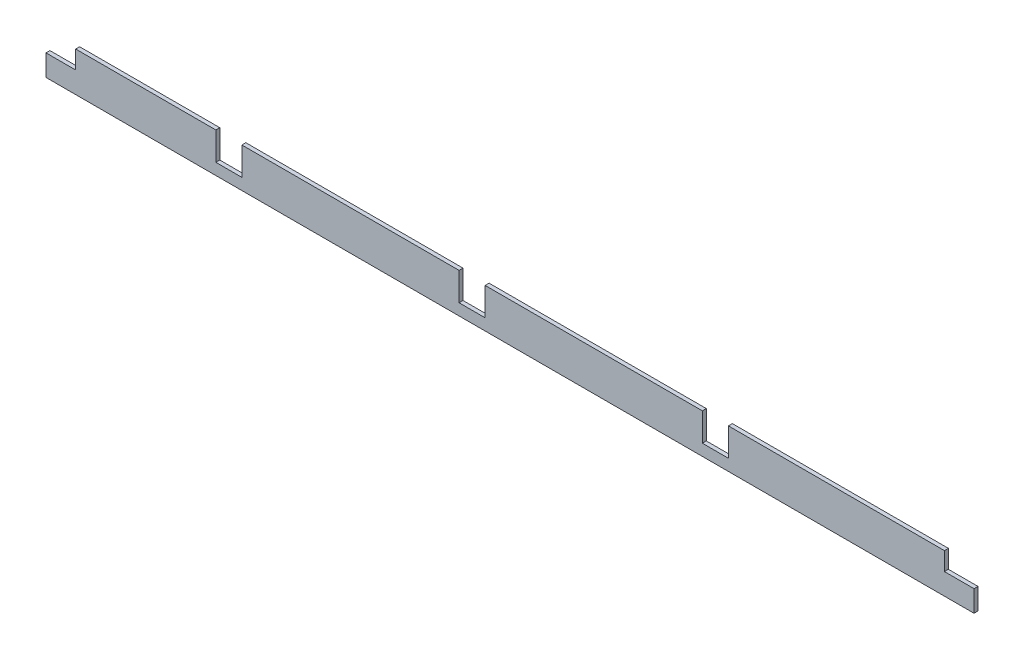
ISO-10303-21;
HEADER;
FILE_DESCRIPTION(('STEP AP214'),'2;1');
FILE_NAME('part.step','',(''),(''),'','','');
FILE_SCHEMA(('AUTOMOTIVE_DESIGN { 1 0 10303 214 1 1 1 1 }'));
ENDSEC;
DATA;
#1=APPLICATION_CONTEXT('core data for automotive mechanical design processes');
#2=APPLICATION_PROTOCOL_DEFINITION('international standard','automotive_design',2000,#1);
#3=PRODUCT_CONTEXT('',#1,'mechanical');
#4=PRODUCT('Part','Part','',(#3));
#5=PRODUCT_RELATED_PRODUCT_CATEGORY('part','',(#4));
#6=PRODUCT_DEFINITION_FORMATION('','',#4);
#7=PRODUCT_DEFINITION_CONTEXT('part definition',#1,'design');
#8=PRODUCT_DEFINITION('design','',#6,#7);
#9=PRODUCT_DEFINITION_SHAPE('','',#8);
#10=(LENGTH_UNIT() NAMED_UNIT(*) SI_UNIT(.MILLI.,.METRE.));
#11=(NAMED_UNIT(*) PLANE_ANGLE_UNIT() SI_UNIT($,.RADIAN.));
#12=(NAMED_UNIT(*) SI_UNIT($,.STERADIAN.) SOLID_ANGLE_UNIT());
#13=UNCERTAINTY_MEASURE_WITH_UNIT(LENGTH_MEASURE(1.E-05),#10,'distance_accuracy_value','');
#14=(GEOMETRIC_REPRESENTATION_CONTEXT(3) GLOBAL_UNCERTAINTY_ASSIGNED_CONTEXT((#13)) GLOBAL_UNIT_ASSIGNED_CONTEXT((#10,
#11,#12)) REPRESENTATION_CONTEXT('',''));
#15=CARTESIAN_POINT('',(0.,0.,0.));
#16=DIRECTION('',(0.,0.,1.));
#17=DIRECTION('',(1.,0.,0.));
#18=AXIS2_PLACEMENT_3D('',#15,#16,#17);
#19=CARTESIAN_POINT('',(0.,0.,1.27));
#20=DIRECTION('',(1.,0.,0.));
#21=DIRECTION('',(0.,0.,-1.));
#22=AXIS2_PLACEMENT_3D('',#19,#20,#21);
#23=PLANE('',#22);
#24=DIRECTION('',(0.,-1.,0.));
#25=VECTOR('',#24,1.);
#26=CARTESIAN_POINT('',(0.,0.,0.));
#27=LINE('',#26,#25);
#28=CARTESIAN_POINT('',(0.,6.858,0.));
#29=VERTEX_POINT('',#28);
#30=CARTESIAN_POINT('',(0.,0.,0.));
#31=VERTEX_POINT('',#30);
#32=EDGE_CURVE('E201',#29,#31,#27,.T.);
#33=ORIENTED_EDGE('',*,*,#32,.T.);
#34=DIRECTION('',(0.,0.,-1.));
#35=VECTOR('',#34,1.);
#36=CARTESIAN_POINT('',(0.,0.,1.27));
#37=LINE('',#36,#35);
#38=CARTESIAN_POINT('',(0.,0.,1.27));
#39=VERTEX_POINT('',#38);
#40=EDGE_CURVE('E11',#39,#31,#37,.T.);
#41=ORIENTED_EDGE('',*,*,#40,.F.);
#42=DIRECTION('',(0.,-1.,0.));
#43=VECTOR('',#42,1.);
#44=CARTESIAN_POINT('',(0.,0.,1.27));
#45=LINE('',#44,#43);
#46=CARTESIAN_POINT('',(0.,6.858,1.27));
#47=VERTEX_POINT('',#46);
#48=EDGE_CURVE('E239',#47,#39,#45,.T.);
#49=ORIENTED_EDGE('',*,*,#48,.F.);
#50=DIRECTION('',(0.,0.,-1.));
#51=VECTOR('',#50,1.);
#52=CARTESIAN_POINT('',(0.,6.858,1.27));
#53=LINE('',#52,#51);
#54=EDGE_CURVE('E197',#47,#29,#53,.T.);
#55=ORIENTED_EDGE('',*,*,#54,.T.);
#56=EDGE_LOOP('',(#33,#41,#49,#55));
#57=FACE_BOUND('',#56,.T.);
#58=ADVANCED_FACE('F33',(#57),#23,.F.);
#59=CARTESIAN_POINT('',(0.,0.,1.27));
#60=DIRECTION('',(0.,1.,0.));
#61=DIRECTION('',(0.,0.,1.));
#62=AXIS2_PLACEMENT_3D('',#59,#60,#61);
#63=PLANE('',#62);
#64=DIRECTION('',(1.,0.,0.));
#65=VECTOR('',#64,1.);
#66=CARTESIAN_POINT('',(0.,0.,0.));
#67=LINE('',#66,#65);
#68=CARTESIAN_POINT('',(298.45,0.,0.));
#69=VERTEX_POINT('',#68);
#70=EDGE_CURVE('E204',#31,#69,#67,.T.);
#71=ORIENTED_EDGE('',*,*,#70,.T.);
#72=DIRECTION('',(0.,0.,-1.));
#73=VECTOR('',#72,1.);
#74=CARTESIAN_POINT('',(298.45,0.,1.27));
#75=LINE('',#74,#73);
#76=CARTESIAN_POINT('',(298.45,0.,1.27));
#77=VERTEX_POINT('',#76);
#78=EDGE_CURVE('E41',#77,#69,#75,.T.);
#79=ORIENTED_EDGE('',*,*,#78,.F.);
#80=DIRECTION('',(1.,0.,0.));
#81=VECTOR('',#80,1.);
#82=CARTESIAN_POINT('',(0.,0.,1.27));
#83=LINE('',#82,#81);
#84=EDGE_CURVE('E128',#39,#77,#83,.T.);
#85=ORIENTED_EDGE('',*,*,#84,.F.);
#86=ORIENTED_EDGE('',*,*,#40,.T.);
#87=EDGE_LOOP('',(#71,#79,#85,#86));
#88=FACE_BOUND('',#87,.T.);
#89=ADVANCED_FACE('F357',(#88),#63,.F.);
#90=CARTESIAN_POINT('',(298.45,0.,1.27));
#91=DIRECTION('',(-1.,0.,0.));
#92=DIRECTION('',(0.,0.,1.));
#93=AXIS2_PLACEMENT_3D('',#90,#91,#92);
#94=PLANE('',#93);
#95=DIRECTION('',(0.,1.,0.));
#96=VECTOR('',#95,1.);
#97=CARTESIAN_POINT('',(298.45,0.,0.));
#98=LINE('',#97,#96);
#99=CARTESIAN_POINT('',(298.45,6.858,0.));
#100=VERTEX_POINT('',#99);
#101=EDGE_CURVE('E206',#69,#100,#98,.T.);
#102=ORIENTED_EDGE('',*,*,#101,.T.);
#103=DIRECTION('',(0.,0.,-1.));
#104=VECTOR('',#103,1.);
#105=CARTESIAN_POINT('',(298.45,6.858,1.27));
#106=LINE('',#105,#104);
#107=CARTESIAN_POINT('',(298.45,6.858,1.27));
#108=VERTEX_POINT('',#107);
#109=EDGE_CURVE('E282',#108,#100,#106,.T.);
#110=ORIENTED_EDGE('',*,*,#109,.F.);
#111=DIRECTION('',(0.,1.,0.));
#112=VECTOR('',#111,1.);
#113=CARTESIAN_POINT('',(298.45,0.,1.27));
#114=LINE('',#113,#112);
#115=EDGE_CURVE('E290',#77,#108,#114,.T.);
#116=ORIENTED_EDGE('',*,*,#115,.F.);
#117=ORIENTED_EDGE('',*,*,#78,.T.);
#118=EDGE_LOOP('',(#102,#110,#116,#117));
#119=FACE_BOUND('',#118,.T.);
#120=ADVANCED_FACE('F288',(#119),#94,.F.);
#121=CARTESIAN_POINT('',(298.45,6.858,1.27));
#122=DIRECTION('',(0.,-1.,0.));
#123=DIRECTION('',(1.,0.,0.));
#124=AXIS2_PLACEMENT_3D('',#121,#122,#123);
#125=PLANE('',#124);
#126=DIRECTION('',(-1.,0.,0.));
#127=VECTOR('',#126,1.);
#128=CARTESIAN_POINT('',(298.45,6.858,0.));
#129=LINE('',#128,#127);
#130=CARTESIAN_POINT('',(288.925,6.85799999999999,0.));
#131=VERTEX_POINT('',#130);
#132=EDGE_CURVE('E208',#100,#131,#129,.T.);
#133=ORIENTED_EDGE('',*,*,#132,.T.);
#134=DIRECTION('',(0.,0.,-1.));
#135=VECTOR('',#134,1.);
#136=CARTESIAN_POINT('',(288.925,6.85799999999999,1.27));
#137=LINE('',#136,#135);
#138=CARTESIAN_POINT('',(288.925,6.85799999999999,1.27));
#139=VERTEX_POINT('',#138);
#140=EDGE_CURVE('E279',#139,#131,#137,.T.);
#141=ORIENTED_EDGE('',*,*,#140,.F.);
#142=DIRECTION('',(-1.,0.,0.));
#143=VECTOR('',#142,1.);
#144=CARTESIAN_POINT('',(298.45,6.858,1.27));
#145=LINE('',#144,#143);
#146=EDGE_CURVE('E308',#108,#139,#145,.T.);
#147=ORIENTED_EDGE('',*,*,#146,.F.);
#148=ORIENTED_EDGE('',*,*,#109,.T.);
#149=EDGE_LOOP('',(#133,#141,#147,#148));
#150=FACE_BOUND('',#149,.T.);
#151=ADVANCED_FACE('F299',(#150),#125,.F.);
#152=CARTESIAN_POINT('',(288.925,6.85799999999999,1.27));
#153=DIRECTION('',(-1.,0.,0.));
#154=DIRECTION('',(0.,0.,1.));
#155=AXIS2_PLACEMENT_3D('',#152,#153,#154);
#156=PLANE('',#155);
#157=DIRECTION('',(0.,1.,0.));
#158=VECTOR('',#157,1.);
#159=CARTESIAN_POINT('',(288.925,6.85799999999999,0.));
#160=LINE('',#159,#158);
#161=CARTESIAN_POINT('',(288.925,12.7,0.));
#162=VERTEX_POINT('',#161);
#163=EDGE_CURVE('E210',#131,#162,#160,.T.);
#164=ORIENTED_EDGE('',*,*,#163,.T.);
#165=DIRECTION('',(0.,0.,-1.));
#166=VECTOR('',#165,1.);
#167=CARTESIAN_POINT('',(288.925,12.7,1.27));
#168=LINE('',#167,#166);
#169=CARTESIAN_POINT('',(288.925,12.7,1.27));
#170=VERTEX_POINT('',#169);
#171=EDGE_CURVE('E276',#170,#162,#168,.T.);
#172=ORIENTED_EDGE('',*,*,#171,.F.);
#173=DIRECTION('',(0.,1.,0.));
#174=VECTOR('',#173,1.);
#175=CARTESIAN_POINT('',(288.925,6.85799999999999,1.27));
#176=LINE('',#175,#174);
#177=EDGE_CURVE('E305',#139,#170,#176,.T.);
#178=ORIENTED_EDGE('',*,*,#177,.F.);
#179=ORIENTED_EDGE('',*,*,#140,.T.);
#180=EDGE_LOOP('',(#164,#172,#178,#179));
#181=FACE_BOUND('',#180,.T.);
#182=ADVANCED_FACE('F303',(#181),#156,.F.);
#183=CARTESIAN_POINT('',(219.456,12.7,1.27));
#184=DIRECTION('',(0.,-1.,0.));
#185=DIRECTION('',(1.,0.,0.));
#186=AXIS2_PLACEMENT_3D('',#183,#184,#185);
#187=PLANE('',#186);
#188=DIRECTION('',(-1.,0.,0.));
#189=VECTOR('',#188,1.);
#190=CARTESIAN_POINT('',(219.456,12.7,0.));
#191=LINE('',#190,#189);
#192=CARTESIAN_POINT('',(219.456,12.7,0.));
#193=VERTEX_POINT('',#192);
#194=EDGE_CURVE('E212',#162,#193,#191,.T.);
#195=ORIENTED_EDGE('',*,*,#194,.T.);
#196=DIRECTION('',(0.,0.,-1.));
#197=VECTOR('',#196,1.);
#198=CARTESIAN_POINT('',(219.456,12.7,1.27));
#199=LINE('',#198,#197);
#200=CARTESIAN_POINT('',(219.456,12.7,1.27));
#201=VERTEX_POINT('',#200);
#202=EDGE_CURVE('E273',#201,#193,#199,.T.);
#203=ORIENTED_EDGE('',*,*,#202,.F.);
#204=DIRECTION('',(-1.,0.,0.));
#205=VECTOR('',#204,1.);
#206=CARTESIAN_POINT('',(219.456,12.7,1.27));
#207=LINE('',#206,#205);
#208=EDGE_CURVE('E307',#170,#201,#207,.T.);
#209=ORIENTED_EDGE('',*,*,#208,.F.);
#210=ORIENTED_EDGE('',*,*,#171,.T.);
#211=EDGE_LOOP('',(#195,#203,#209,#210));
#212=FACE_BOUND('',#211,.T.);
#213=ADVANCED_FACE('F370',(#212),#187,.F.);
#214=CARTESIAN_POINT('',(219.456,12.7,1.27));
#215=DIRECTION('',(1.,0.,0.));
#216=DIRECTION('',(0.,0.,-1.));
#217=AXIS2_PLACEMENT_3D('',#214,#215,#216);
#218=PLANE('',#217);
#219=DIRECTION('',(0.,-1.,0.));
#220=VECTOR('',#219,1.);
#221=CARTESIAN_POINT('',(219.456,12.7,0.));
#222=LINE('',#221,#220);
#223=CARTESIAN_POINT('',(219.456,3.6830000000002,0.));
#224=VERTEX_POINT('',#223);
#225=EDGE_CURVE('E214',#193,#224,#222,.T.);
#226=ORIENTED_EDGE('',*,*,#225,.T.);
#227=DIRECTION('',(0.,0.,-1.));
#228=VECTOR('',#227,1.);
#229=CARTESIAN_POINT('',(219.456,3.6830000000002,1.27));
#230=LINE('',#229,#228);
#231=CARTESIAN_POINT('',(219.456,3.6830000000002,1.27));
#232=VERTEX_POINT('',#231);
#233=EDGE_CURVE('E270',#232,#224,#230,.T.);
#234=ORIENTED_EDGE('',*,*,#233,.F.);
#235=DIRECTION('',(0.,-1.,0.));
#236=VECTOR('',#235,1.);
#237=CARTESIAN_POINT('',(219.456,12.7,1.27));
#238=LINE('',#237,#236);
#239=EDGE_CURVE('E310',#201,#232,#238,.T.);
#240=ORIENTED_EDGE('',*,*,#239,.F.);
#241=ORIENTED_EDGE('',*,*,#202,.T.);
#242=EDGE_LOOP('',(#226,#234,#240,#241));
#243=FACE_BOUND('',#242,.T.);
#244=ADVANCED_FACE('F373',(#243),#218,.F.);
#245=CARTESIAN_POINT('',(211.074,3.6830000000002,1.27));
#246=DIRECTION('',(0.,-1.,0.));
#247=DIRECTION('',(1.,0.,0.));
#248=AXIS2_PLACEMENT_3D('',#245,#246,#247);
#249=PLANE('',#248);
#250=DIRECTION('',(-1.,0.,0.));
#251=VECTOR('',#250,1.);
#252=CARTESIAN_POINT('',(211.074,3.6830000000002,0.));
#253=LINE('',#252,#251);
#254=CARTESIAN_POINT('',(211.074,3.6830000000002,0.));
#255=VERTEX_POINT('',#254);
#256=EDGE_CURVE('E216',#224,#255,#253,.T.);
#257=ORIENTED_EDGE('',*,*,#256,.T.);
#258=DIRECTION('',(0.,0.,-1.));
#259=VECTOR('',#258,1.);
#260=CARTESIAN_POINT('',(211.074,3.6830000000002,1.27));
#261=LINE('',#260,#259);
#262=CARTESIAN_POINT('',(211.074,3.6830000000002,1.27));
#263=VERTEX_POINT('',#262);
#264=EDGE_CURVE('E267',#263,#255,#261,.T.);
#265=ORIENTED_EDGE('',*,*,#264,.F.);
#266=DIRECTION('',(-1.,0.,0.));
#267=VECTOR('',#266,1.);
#268=CARTESIAN_POINT('',(211.074,3.6830000000002,1.27));
#269=LINE('',#268,#267);
#270=EDGE_CURVE('E316',#232,#263,#269,.T.);
#271=ORIENTED_EDGE('',*,*,#270,.F.);
#272=ORIENTED_EDGE('',*,*,#233,.T.);
#273=EDGE_LOOP('',(#257,#265,#271,#272));
#274=FACE_BOUND('',#273,.T.);
#275=ADVANCED_FACE('F377',(#274),#249,.F.);
#276=CARTESIAN_POINT('',(211.074,12.7,1.27));
#277=DIRECTION('',(-1.,0.,0.));
#278=DIRECTION('',(0.,0.,1.));
#279=AXIS2_PLACEMENT_3D('',#276,#277,#278);
#280=PLANE('',#279);
#281=DIRECTION('',(0.,1.,0.));
#282=VECTOR('',#281,1.);
#283=CARTESIAN_POINT('',(211.074,12.7,0.));
#284=LINE('',#283,#282);
#285=CARTESIAN_POINT('',(211.074,12.7,0.));
#286=VERTEX_POINT('',#285);
#287=EDGE_CURVE('E218',#255,#286,#284,.T.);
#288=ORIENTED_EDGE('',*,*,#287,.T.);
#289=DIRECTION('',(0.,0.,-1.));
#290=VECTOR('',#289,1.);
#291=CARTESIAN_POINT('',(211.074,12.7,1.27));
#292=LINE('',#291,#290);
#293=CARTESIAN_POINT('',(211.074,12.7,1.27));
#294=VERTEX_POINT('',#293);
#295=EDGE_CURVE('E264',#294,#286,#292,.T.);
#296=ORIENTED_EDGE('',*,*,#295,.F.);
#297=DIRECTION('',(0.,1.,0.));
#298=VECTOR('',#297,1.);
#299=CARTESIAN_POINT('',(211.074,12.7,1.27));
#300=LINE('',#299,#298);
#301=EDGE_CURVE('E318',#263,#294,#300,.T.);
#302=ORIENTED_EDGE('',*,*,#301,.F.);
#303=ORIENTED_EDGE('',*,*,#264,.T.);
#304=EDGE_LOOP('',(#288,#296,#302,#303));
#305=FACE_BOUND('',#304,.T.);
#306=ADVANCED_FACE('F381',(#305),#280,.F.);
#307=CARTESIAN_POINT('',(141.224,12.7,1.27));
#308=DIRECTION('',(0.,-1.,0.));
#309=DIRECTION('',(0.,0.,-1.));
#310=AXIS2_PLACEMENT_3D('',#307,#308,#309);
#311=PLANE('',#310);
#312=DIRECTION('',(-1.,0.,0.));
#313=VECTOR('',#312,1.);
#314=CARTESIAN_POINT('',(141.224,12.7,0.));
#315=LINE('',#314,#313);
#316=CARTESIAN_POINT('',(141.224,12.7,0.));
#317=VERTEX_POINT('',#316);
#318=EDGE_CURVE('E220',#286,#317,#315,.T.);
#319=ORIENTED_EDGE('',*,*,#318,.T.);
#320=DIRECTION('',(0.,0.,-1.));
#321=VECTOR('',#320,1.);
#322=CARTESIAN_POINT('',(141.224,12.7,1.27));
#323=LINE('',#322,#321);
#324=CARTESIAN_POINT('',(141.224,12.7,1.27));
#325=VERTEX_POINT('',#324);
#326=EDGE_CURVE('E261',#325,#317,#323,.T.);
#327=ORIENTED_EDGE('',*,*,#326,.F.);
#328=DIRECTION('',(-1.,0.,0.));
#329=VECTOR('',#328,1.);
#330=CARTESIAN_POINT('',(141.224,12.7,1.27));
#331=LINE('',#330,#329);
#332=EDGE_CURVE('E320',#294,#325,#331,.T.);
#333=ORIENTED_EDGE('',*,*,#332,.F.);
#334=ORIENTED_EDGE('',*,*,#295,.T.);
#335=EDGE_LOOP('',(#319,#327,#333,#334));
#336=FACE_BOUND('',#335,.T.);
#337=ADVANCED_FACE('F385',(#336),#311,.F.);
#338=CARTESIAN_POINT('',(141.224,12.7,1.27));
#339=DIRECTION('',(1.,0.,0.));
#340=DIRECTION('',(0.,0.,-1.));
#341=AXIS2_PLACEMENT_3D('',#338,#339,#340);
#342=PLANE('',#341);
#343=DIRECTION('',(0.,-1.,0.));
#344=VECTOR('',#343,1.);
#345=CARTESIAN_POINT('',(141.224,12.7,0.));
#346=LINE('',#345,#344);
#347=CARTESIAN_POINT('',(141.224,3.68300000000009,0.));
#348=VERTEX_POINT('',#347);
#349=EDGE_CURVE('E222',#317,#348,#346,.T.);
#350=ORIENTED_EDGE('',*,*,#349,.T.);
#351=DIRECTION('',(0.,0.,-1.));
#352=VECTOR('',#351,1.);
#353=CARTESIAN_POINT('',(141.224,3.68300000000009,1.27));
#354=LINE('',#353,#352);
#355=CARTESIAN_POINT('',(141.224,3.68300000000009,1.27));
#356=VERTEX_POINT('',#355);
#357=EDGE_CURVE('E258',#356,#348,#354,.T.);
#358=ORIENTED_EDGE('',*,*,#357,.F.);
#359=DIRECTION('',(0.,-1.,0.));
#360=VECTOR('',#359,1.);
#361=CARTESIAN_POINT('',(141.224,12.7,1.27));
#362=LINE('',#361,#360);
#363=EDGE_CURVE('E322',#325,#356,#362,.T.);
#364=ORIENTED_EDGE('',*,*,#363,.F.);
#365=ORIENTED_EDGE('',*,*,#326,.T.);
#366=EDGE_LOOP('',(#350,#358,#364,#365));
#367=FACE_BOUND('',#366,.T.);
#368=ADVANCED_FACE('F389',(#367),#342,.F.);
#369=CARTESIAN_POINT('',(132.842,3.68300000000009,1.27));
#370=DIRECTION('',(0.,-1.,0.));
#371=DIRECTION('',(1.,0.,0.));
#372=AXIS2_PLACEMENT_3D('',#369,#370,#371);
#373=PLANE('',#372);
#374=DIRECTION('',(-1.,0.,0.));
#375=VECTOR('',#374,1.);
#376=CARTESIAN_POINT('',(132.842,3.68300000000009,0.));
#377=LINE('',#376,#375);
#378=CARTESIAN_POINT('',(132.842,3.68300000000009,0.));
#379=VERTEX_POINT('',#378);
#380=EDGE_CURVE('E224',#348,#379,#377,.T.);
#381=ORIENTED_EDGE('',*,*,#380,.T.);
#382=DIRECTION('',(0.,0.,-1.));
#383=VECTOR('',#382,1.);
#384=CARTESIAN_POINT('',(132.842,3.68300000000009,1.27));
#385=LINE('',#384,#383);
#386=CARTESIAN_POINT('',(132.842,3.68300000000009,1.27));
#387=VERTEX_POINT('',#386);
#388=EDGE_CURVE('E255',#387,#379,#385,.T.);
#389=ORIENTED_EDGE('',*,*,#388,.F.);
#390=DIRECTION('',(-1.,0.,0.));
#391=VECTOR('',#390,1.);
#392=CARTESIAN_POINT('',(132.842,3.68300000000009,1.27));
#393=LINE('',#392,#391);
#394=EDGE_CURVE('E324',#356,#387,#393,.T.);
#395=ORIENTED_EDGE('',*,*,#394,.F.);
#396=ORIENTED_EDGE('',*,*,#357,.T.);
#397=EDGE_LOOP('',(#381,#389,#395,#396));
#398=FACE_BOUND('',#397,.T.);
#399=ADVANCED_FACE('F393',(#398),#373,.F.);
#400=CARTESIAN_POINT('',(132.842,12.7,1.27));
#401=DIRECTION('',(-1.,0.,0.));
#402=DIRECTION('',(0.,0.,1.));
#403=AXIS2_PLACEMENT_3D('',#400,#401,#402);
#404=PLANE('',#403);
#405=DIRECTION('',(0.,1.,0.));
#406=VECTOR('',#405,1.);
#407=CARTESIAN_POINT('',(132.842,12.7,0.));
#408=LINE('',#407,#406);
#409=CARTESIAN_POINT('',(132.842,12.7,0.));
#410=VERTEX_POINT('',#409);
#411=EDGE_CURVE('E226',#379,#410,#408,.T.);
#412=ORIENTED_EDGE('',*,*,#411,.T.);
#413=DIRECTION('',(0.,0.,-1.));
#414=VECTOR('',#413,1.);
#415=CARTESIAN_POINT('',(132.842,12.7,1.27));
#416=LINE('',#415,#414);
#417=CARTESIAN_POINT('',(132.842,12.7,1.27));
#418=VERTEX_POINT('',#417);
#419=EDGE_CURVE('E252',#418,#410,#416,.T.);
#420=ORIENTED_EDGE('',*,*,#419,.F.);
#421=DIRECTION('',(0.,1.,0.));
#422=VECTOR('',#421,1.);
#423=CARTESIAN_POINT('',(132.842,12.7,1.27));
#424=LINE('',#423,#422);
#425=EDGE_CURVE('E326',#387,#418,#424,.T.);
#426=ORIENTED_EDGE('',*,*,#425,.F.);
#427=ORIENTED_EDGE('',*,*,#388,.T.);
#428=EDGE_LOOP('',(#412,#420,#426,#427));
#429=FACE_BOUND('',#428,.T.);
#430=ADVANCED_FACE('F397',(#429),#404,.F.);
#431=CARTESIAN_POINT('',(62.992,12.7,1.27));
#432=DIRECTION('',(0.,-1.,0.));
#433=DIRECTION('',(0.,0.,-1.));
#434=AXIS2_PLACEMENT_3D('',#431,#432,#433);
#435=PLANE('',#434);
#436=DIRECTION('',(-1.,0.,0.));
#437=VECTOR('',#436,1.);
#438=CARTESIAN_POINT('',(62.992,12.7,0.));
#439=LINE('',#438,#437);
#440=CARTESIAN_POINT('',(62.992,12.7,0.));
#441=VERTEX_POINT('',#440);
#442=EDGE_CURVE('E228',#410,#441,#439,.T.);
#443=ORIENTED_EDGE('',*,*,#442,.T.);
#444=DIRECTION('',(0.,0.,-1.));
#445=VECTOR('',#444,1.);
#446=CARTESIAN_POINT('',(62.992,12.7,1.27));
#447=LINE('',#446,#445);
#448=CARTESIAN_POINT('',(62.992,12.7,1.27));
#449=VERTEX_POINT('',#448);
#450=EDGE_CURVE('E249',#449,#441,#447,.T.);
#451=ORIENTED_EDGE('',*,*,#450,.F.);
#452=DIRECTION('',(-1.,0.,0.));
#453=VECTOR('',#452,1.);
#454=CARTESIAN_POINT('',(62.992,12.7,1.27));
#455=LINE('',#454,#453);
#456=EDGE_CURVE('E328',#418,#449,#455,.T.);
#457=ORIENTED_EDGE('',*,*,#456,.F.);
#458=ORIENTED_EDGE('',*,*,#419,.T.);
#459=EDGE_LOOP('',(#443,#451,#457,#458));
#460=FACE_BOUND('',#459,.T.);
#461=ADVANCED_FACE('F401',(#460),#435,.F.);
#462=CARTESIAN_POINT('',(62.992,12.7,1.27));
#463=DIRECTION('',(1.,0.,0.));
#464=DIRECTION('',(0.,0.,-1.));
#465=AXIS2_PLACEMENT_3D('',#462,#463,#464);
#466=PLANE('',#465);
#467=DIRECTION('',(0.,-1.,0.));
#468=VECTOR('',#467,1.);
#469=CARTESIAN_POINT('',(62.992,12.7,0.));
#470=LINE('',#469,#468);
#471=CARTESIAN_POINT('',(62.992,3.683,0.));
#472=VERTEX_POINT('',#471);
#473=EDGE_CURVE('E230',#441,#472,#470,.T.);
#474=ORIENTED_EDGE('',*,*,#473,.T.);
#475=DIRECTION('',(0.,0.,-1.));
#476=VECTOR('',#475,1.);
#477=CARTESIAN_POINT('',(62.992,3.683,1.27));
#478=LINE('',#477,#476);
#479=CARTESIAN_POINT('',(62.992,3.683,1.27));
#480=VERTEX_POINT('',#479);
#481=EDGE_CURVE('E246',#480,#472,#478,.T.);
#482=ORIENTED_EDGE('',*,*,#481,.F.);
#483=DIRECTION('',(0.,-1.,0.));
#484=VECTOR('',#483,1.);
#485=CARTESIAN_POINT('',(62.992,12.7,1.27));
#486=LINE('',#485,#484);
#487=EDGE_CURVE('E330',#449,#480,#486,.T.);
#488=ORIENTED_EDGE('',*,*,#487,.F.);
#489=ORIENTED_EDGE('',*,*,#450,.T.);
#490=EDGE_LOOP('',(#474,#482,#488,#489));
#491=FACE_BOUND('',#490,.T.);
#492=ADVANCED_FACE('F405',(#491),#466,.F.);
#493=CARTESIAN_POINT('',(54.61,3.683,1.27));
#494=DIRECTION('',(0.,-1.,0.));
#495=DIRECTION('',(0.,0.,-1.));
#496=AXIS2_PLACEMENT_3D('',#493,#494,#495);
#497=PLANE('',#496);
#498=DIRECTION('',(-1.,0.,0.));
#499=VECTOR('',#498,1.);
#500=CARTESIAN_POINT('',(54.61,3.683,0.));
#501=LINE('',#500,#499);
#502=CARTESIAN_POINT('',(54.61,3.683,0.));
#503=VERTEX_POINT('',#502);
#504=EDGE_CURVE('E232',#472,#503,#501,.T.);
#505=ORIENTED_EDGE('',*,*,#504,.T.);
#506=DIRECTION('',(0.,0.,-1.));
#507=VECTOR('',#506,1.);
#508=CARTESIAN_POINT('',(54.61,3.683,1.27));
#509=LINE('',#508,#507);
#510=CARTESIAN_POINT('',(54.61,3.683,1.27));
#511=VERTEX_POINT('',#510);
#512=EDGE_CURVE('E243',#511,#503,#509,.T.);
#513=ORIENTED_EDGE('',*,*,#512,.F.);
#514=DIRECTION('',(-1.,0.,0.));
#515=VECTOR('',#514,1.);
#516=CARTESIAN_POINT('',(54.61,3.683,1.27));
#517=LINE('',#516,#515);
#518=EDGE_CURVE('E332',#480,#511,#517,.T.);
#519=ORIENTED_EDGE('',*,*,#518,.F.);
#520=ORIENTED_EDGE('',*,*,#481,.T.);
#521=EDGE_LOOP('',(#505,#513,#519,#520));
#522=FACE_BOUND('',#521,.T.);
#523=ADVANCED_FACE('F338',(#522),#497,.F.);
#524=CARTESIAN_POINT('',(54.61,12.7,1.27));
#525=DIRECTION('',(-1.,0.,0.));
#526=DIRECTION('',(0.,0.,1.));
#527=AXIS2_PLACEMENT_3D('',#524,#525,#526);
#528=PLANE('',#527);
#529=DIRECTION('',(0.,1.,0.));
#530=VECTOR('',#529,1.);
#531=CARTESIAN_POINT('',(54.61,12.7,0.));
#532=LINE('',#531,#530);
#533=CARTESIAN_POINT('',(54.61,12.7,0.));
#534=VERTEX_POINT('',#533);
#535=EDGE_CURVE('E234',#503,#534,#532,.T.);
#536=ORIENTED_EDGE('',*,*,#535,.T.);
#537=DIRECTION('',(0.,0.,-1.));
#538=VECTOR('',#537,1.);
#539=CARTESIAN_POINT('',(54.61,12.7,1.27));
#540=LINE('',#539,#538);
#541=CARTESIAN_POINT('',(54.61,12.7,1.27));
#542=VERTEX_POINT('',#541);
#543=EDGE_CURVE('E192',#542,#534,#540,.T.);
#544=ORIENTED_EDGE('',*,*,#543,.F.);
#545=DIRECTION('',(0.,1.,0.));
#546=VECTOR('',#545,1.);
#547=CARTESIAN_POINT('',(54.61,12.7,1.27));
#548=LINE('',#547,#546);
#549=EDGE_CURVE('E183',#511,#542,#548,.T.);
#550=ORIENTED_EDGE('',*,*,#549,.F.);
#551=ORIENTED_EDGE('',*,*,#512,.T.);
#552=EDGE_LOOP('',(#536,#544,#550,#551));
#553=FACE_BOUND('',#552,.T.);
#554=ADVANCED_FACE('F342',(#553),#528,.F.);
#555=CARTESIAN_POINT('',(9.525,12.7,1.27));
#556=DIRECTION('',(0.,-1.,0.));
#557=DIRECTION('',(0.,0.,-1.));
#558=AXIS2_PLACEMENT_3D('',#555,#556,#557);
#559=PLANE('',#558);
#560=DIRECTION('',(-1.,0.,0.));
#561=VECTOR('',#560,1.);
#562=CARTESIAN_POINT('',(9.525,12.7,0.));
#563=LINE('',#562,#561);
#564=CARTESIAN_POINT('',(9.525,12.7,0.));
#565=VERTEX_POINT('',#564);
#566=EDGE_CURVE('E191',#534,#565,#563,.T.);
#567=ORIENTED_EDGE('',*,*,#566,.T.);
#568=DIRECTION('',(0.,0.,-1.));
#569=VECTOR('',#568,1.);
#570=CARTESIAN_POINT('',(9.525,12.7,1.27));
#571=LINE('',#570,#569);
#572=CARTESIAN_POINT('',(9.525,12.7,1.27));
#573=VERTEX_POINT('',#572);
#574=EDGE_CURVE('E188',#573,#565,#571,.T.);
#575=ORIENTED_EDGE('',*,*,#574,.F.);
#576=DIRECTION('',(-1.,0.,0.));
#577=VECTOR('',#576,1.);
#578=CARTESIAN_POINT('',(9.525,12.7,1.27));
#579=LINE('',#578,#577);
#580=EDGE_CURVE('E177',#542,#573,#579,.T.);
#581=ORIENTED_EDGE('',*,*,#580,.F.);
#582=ORIENTED_EDGE('',*,*,#543,.T.);
#583=EDGE_LOOP('',(#567,#575,#581,#582));
#584=FACE_BOUND('',#583,.T.);
#585=ADVANCED_FACE('F189',(#584),#559,.F.);
#586=CARTESIAN_POINT('',(9.525,12.7,1.27));
#587=DIRECTION('',(1.,0.,0.));
#588=DIRECTION('',(0.,0.,-1.));
#589=AXIS2_PLACEMENT_3D('',#586,#587,#588);
#590=PLANE('',#589);
#591=DIRECTION('',(0.,-1.,0.));
#592=VECTOR('',#591,1.);
#593=CARTESIAN_POINT('',(9.525,12.7,0.));
#594=LINE('',#593,#592);
#595=CARTESIAN_POINT('',(9.525,6.858,0.));
#596=VERTEX_POINT('',#595);
#597=EDGE_CURVE('E114',#565,#596,#594,.T.);
#598=ORIENTED_EDGE('',*,*,#597,.T.);
#599=DIRECTION('',(0.,0.,-1.));
#600=VECTOR('',#599,1.);
#601=CARTESIAN_POINT('',(9.525,6.858,1.27));
#602=LINE('',#601,#600);
#603=CARTESIAN_POINT('',(9.525,6.858,1.27));
#604=VERTEX_POINT('',#603);
#605=EDGE_CURVE('E193',#604,#596,#602,.T.);
#606=ORIENTED_EDGE('',*,*,#605,.F.);
#607=DIRECTION('',(0.,-1.,0.));
#608=VECTOR('',#607,1.);
#609=CARTESIAN_POINT('',(9.525,12.7,1.27));
#610=LINE('',#609,#608);
#611=EDGE_CURVE('E181',#573,#604,#610,.T.);
#612=ORIENTED_EDGE('',*,*,#611,.F.);
#613=ORIENTED_EDGE('',*,*,#574,.T.);
#614=EDGE_LOOP('',(#598,#606,#612,#613));
#615=FACE_BOUND('',#614,.T.);
#616=ADVANCED_FACE('F195',(#615),#590,.F.);
#617=CARTESIAN_POINT('',(0.,6.858,1.27));
#618=DIRECTION('',(0.,-1.,0.));
#619=DIRECTION('',(0.,0.,-1.));
#620=AXIS2_PLACEMENT_3D('',#617,#618,#619);
#621=PLANE('',#620);
#622=DIRECTION('',(-1.,0.,0.));
#623=VECTOR('',#622,1.);
#624=CARTESIAN_POINT('',(0.,6.858,0.));
#625=LINE('',#624,#623);
#626=EDGE_CURVE('E120',#596,#29,#625,.T.);
#627=ORIENTED_EDGE('',*,*,#626,.T.);
#628=ORIENTED_EDGE('',*,*,#54,.F.);
#629=DIRECTION('',(-1.,0.,0.));
#630=VECTOR('',#629,1.);
#631=CARTESIAN_POINT('',(0.,6.858,1.27));
#632=LINE('',#631,#630);
#633=EDGE_CURVE('E49',#604,#47,#632,.T.);
#634=ORIENTED_EDGE('',*,*,#633,.F.);
#635=ORIENTED_EDGE('',*,*,#605,.T.);
#636=EDGE_LOOP('',(#627,#628,#634,#635));
#637=FACE_BOUND('',#636,.T.);
#638=ADVANCED_FACE('F346',(#637),#621,.F.);
#639=CARTESIAN_POINT('',(0.,0.,1.27));
#640=DIRECTION('',(0.,0.,-1.));
#641=DIRECTION('',(-1.,0.,0.));
#642=AXIS2_PLACEMENT_3D('',#639,#640,#641);
#643=PLANE('',#642);
#644=ORIENTED_EDGE('',*,*,#48,.T.);
#645=ORIENTED_EDGE('',*,*,#84,.T.);
#646=ORIENTED_EDGE('',*,*,#115,.T.);
#647=ORIENTED_EDGE('',*,*,#146,.T.);
#648=ORIENTED_EDGE('',*,*,#177,.T.);
#649=ORIENTED_EDGE('',*,*,#208,.T.);
#650=ORIENTED_EDGE('',*,*,#239,.T.);
#651=ORIENTED_EDGE('',*,*,#270,.T.);
#652=ORIENTED_EDGE('',*,*,#301,.T.);
#653=ORIENTED_EDGE('',*,*,#332,.T.);
#654=ORIENTED_EDGE('',*,*,#363,.T.);
#655=ORIENTED_EDGE('',*,*,#394,.T.);
#656=ORIENTED_EDGE('',*,*,#425,.T.);
#657=ORIENTED_EDGE('',*,*,#456,.T.);
#658=ORIENTED_EDGE('',*,*,#487,.T.);
#659=ORIENTED_EDGE('',*,*,#518,.T.);
#660=ORIENTED_EDGE('',*,*,#549,.T.);
#661=ORIENTED_EDGE('',*,*,#580,.T.);
#662=ORIENTED_EDGE('',*,*,#611,.T.);
#663=ORIENTED_EDGE('',*,*,#633,.T.);
#664=EDGE_LOOP('',(#644,#645,#646,#647,#648,#649,#650,#651,#652,#653,#654,#655,#656,#657,#658,
#659,#660,#661,#662,#663));
#665=FACE_BOUND('',#664,.T.);
#666=ADVANCED_FACE('F179',(#665),#643,.F.);
#667=CARTESIAN_POINT('',(0.,0.,0.));
#668=DIRECTION('',(0.,0.,-1.));
#669=DIRECTION('',(-1.,0.,0.));
#670=AXIS2_PLACEMENT_3D('',#667,#668,#669);
#671=PLANE('',#670);
#672=ORIENTED_EDGE('',*,*,#32,.F.);
#673=ORIENTED_EDGE('',*,*,#626,.F.);
#674=ORIENTED_EDGE('',*,*,#597,.F.);
#675=ORIENTED_EDGE('',*,*,#566,.F.);
#676=ORIENTED_EDGE('',*,*,#535,.F.);
#677=ORIENTED_EDGE('',*,*,#504,.F.);
#678=ORIENTED_EDGE('',*,*,#473,.F.);
#679=ORIENTED_EDGE('',*,*,#442,.F.);
#680=ORIENTED_EDGE('',*,*,#411,.F.);
#681=ORIENTED_EDGE('',*,*,#380,.F.);
#682=ORIENTED_EDGE('',*,*,#349,.F.);
#683=ORIENTED_EDGE('',*,*,#318,.F.);
#684=ORIENTED_EDGE('',*,*,#287,.F.);
#685=ORIENTED_EDGE('',*,*,#256,.F.);
#686=ORIENTED_EDGE('',*,*,#225,.F.);
#687=ORIENTED_EDGE('',*,*,#194,.F.);
#688=ORIENTED_EDGE('',*,*,#163,.F.);
#689=ORIENTED_EDGE('',*,*,#132,.F.);
#690=ORIENTED_EDGE('',*,*,#101,.F.);
#691=ORIENTED_EDGE('',*,*,#70,.F.);
#692=EDGE_LOOP('',(#672,#673,#674,#675,#676,#677,#678,#679,#680,#681,#682,#683,#684,#685,#686,
#687,#688,#689,#690,#691));
#693=FACE_BOUND('',#692,.T.);
#694=ADVANCED_FACE('F294',(#693),#671,.T.);
#695=CLOSED_SHELL('',(#58,#89,#120,#151,#182,#213,#244,#275,#306,#337,#368,#399,#430,#461,#492,
#523,#554,#585,#616,#638,#666,#694));
#696=MANIFOLD_SOLID_BREP('B2',#695);
#697=ADVANCED_BREP_SHAPE_REPRESENTATION('',(#18,#696),#14);
#698=SHAPE_DEFINITION_REPRESENTATION(#9,#697);
ENDSEC;
END-ISO-10303-21;
